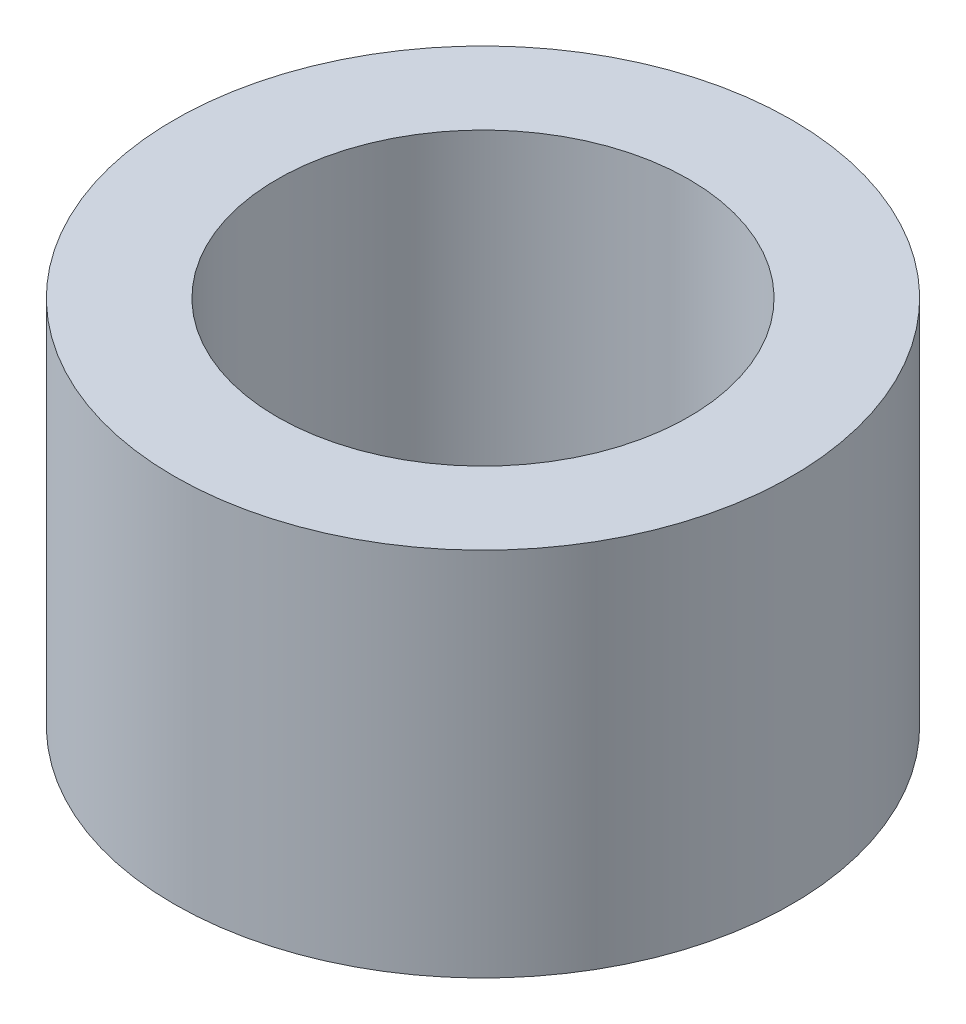
ISO-10303-21;
HEADER;
FILE_DESCRIPTION(('STEP AP214'),'2;1');
FILE_NAME('part.step','',(''),(''),'','','');
FILE_SCHEMA(('AUTOMOTIVE_DESIGN { 1 0 10303 214 1 1 1 1 }'));
ENDSEC;
DATA;
#1=APPLICATION_CONTEXT('core data for automotive mechanical design processes');
#2=APPLICATION_PROTOCOL_DEFINITION('international standard','automotive_design',2000,#1);
#3=PRODUCT_CONTEXT('',#1,'mechanical');
#4=PRODUCT('Part','Part','',(#3));
#5=PRODUCT_RELATED_PRODUCT_CATEGORY('part','',(#4));
#6=PRODUCT_DEFINITION_FORMATION('','',#4);
#7=PRODUCT_DEFINITION_CONTEXT('part definition',#1,'design');
#8=PRODUCT_DEFINITION('design','',#6,#7);
#9=PRODUCT_DEFINITION_SHAPE('','',#8);
#10=(LENGTH_UNIT() NAMED_UNIT(*) SI_UNIT(.MILLI.,.METRE.));
#11=(NAMED_UNIT(*) PLANE_ANGLE_UNIT() SI_UNIT($,.RADIAN.));
#12=(NAMED_UNIT(*) SI_UNIT($,.STERADIAN.) SOLID_ANGLE_UNIT());
#13=UNCERTAINTY_MEASURE_WITH_UNIT(LENGTH_MEASURE(1.E-05),#10,'distance_accuracy_value','');
#14=(GEOMETRIC_REPRESENTATION_CONTEXT(3) GLOBAL_UNCERTAINTY_ASSIGNED_CONTEXT((#13)) GLOBAL_UNIT_ASSIGNED_CONTEXT((#10,
#11,#12)) REPRESENTATION_CONTEXT('',''));
#15=CARTESIAN_POINT('',(0.,0.,0.));
#16=DIRECTION('',(0.,0.,1.));
#17=DIRECTION('',(1.,0.,0.));
#18=AXIS2_PLACEMENT_3D('',#15,#16,#17);
#19=CARTESIAN_POINT('',(0.,3.6,0.));
#20=DIRECTION('',(0.,1.,0.));
#21=DIRECTION('',(0.,0.,1.));
#22=AXIS2_PLACEMENT_3D('',#19,#20,#21);
#23=PLANE('',#22);
#24=CARTESIAN_POINT('',(0.,3.6,0.));
#25=DIRECTION('',(0.,1.,0.));
#26=DIRECTION('',(0.,0.,1.));
#27=AXIS2_PLACEMENT_3D('',#24,#25,#26);
#28=CIRCLE('',#27,3.);
#29=CARTESIAN_POINT('',(0.,3.6,3.));
#30=VERTEX_POINT('',#29);
#31=EDGE_CURVE('E10',#30,#30,#28,.T.);
#32=ORIENTED_EDGE('',*,*,#31,.T.);
#33=EDGE_LOOP('',(#32));
#34=FACE_BOUND('',#33,.T.);
#35=CARTESIAN_POINT('',(0.,3.6,0.));
#36=DIRECTION('',(0.,1.,0.));
#37=DIRECTION('',(0.,0.,1.));
#38=AXIS2_PLACEMENT_3D('',#35,#36,#37);
#39=CIRCLE('',#38,2.);
#40=CARTESIAN_POINT('',(0.,3.6,2.));
#41=VERTEX_POINT('',#40);
#42=EDGE_CURVE('E43',#41,#41,#39,.T.);
#43=ORIENTED_EDGE('',*,*,#42,.F.);
#44=EDGE_LOOP('',(#43));
#45=FACE_BOUND('',#44,.T.);
#46=ADVANCED_FACE('F32',(#34,#45),#23,.T.);
#47=CARTESIAN_POINT('',(0.,0.,0.));
#48=DIRECTION('',(0.,1.,0.));
#49=DIRECTION('',(0.,0.,1.));
#50=AXIS2_PLACEMENT_3D('',#47,#48,#49);
#51=PLANE('',#50);
#52=CARTESIAN_POINT('',(0.,0.,0.));
#53=DIRECTION('',(0.,1.,0.));
#54=DIRECTION('',(0.,0.,1.));
#55=AXIS2_PLACEMENT_3D('',#52,#53,#54);
#56=CIRCLE('',#55,3.);
#57=CARTESIAN_POINT('',(0.,0.,3.));
#58=VERTEX_POINT('',#57);
#59=EDGE_CURVE('E36',#58,#58,#56,.T.);
#60=ORIENTED_EDGE('',*,*,#59,.F.);
#61=EDGE_LOOP('',(#60));
#62=FACE_BOUND('',#61,.T.);
#63=CARTESIAN_POINT('',(0.,0.,0.));
#64=DIRECTION('',(0.,1.,0.));
#65=DIRECTION('',(0.,0.,1.));
#66=AXIS2_PLACEMENT_3D('',#63,#64,#65);
#67=CIRCLE('',#66,2.);
#68=CARTESIAN_POINT('',(0.,0.,2.));
#69=VERTEX_POINT('',#68);
#70=EDGE_CURVE('E45',#69,#69,#67,.T.);
#71=ORIENTED_EDGE('',*,*,#70,.T.);
#72=EDGE_LOOP('',(#71));
#73=FACE_BOUND('',#72,.T.);
#74=ADVANCED_FACE('F55',(#62,#73),#51,.F.);
#75=CARTESIAN_POINT('',(0.,3.6,0.));
#76=DIRECTION('',(0.,-1.,0.));
#77=DIRECTION('',(0.,0.,-1.));
#78=AXIS2_PLACEMENT_3D('',#75,#76,#77);
#79=CYLINDRICAL_SURFACE('',#78,3.);
#80=ORIENTED_EDGE('',*,*,#31,.F.);
#81=EDGE_LOOP('',(#80));
#82=FACE_BOUND('',#81,.T.);
#83=ORIENTED_EDGE('',*,*,#59,.T.);
#84=EDGE_LOOP('',(#83));
#85=FACE_BOUND('',#84,.T.);
#86=ADVANCED_FACE('F34',(#82,#85),#79,.T.);
#87=CARTESIAN_POINT('',(0.,3.6,0.));
#88=DIRECTION('',(0.,-1.,0.));
#89=DIRECTION('',(0.,0.,-1.));
#90=AXIS2_PLACEMENT_3D('',#87,#88,#89);
#91=CYLINDRICAL_SURFACE('',#90,2.);
#92=ORIENTED_EDGE('',*,*,#42,.T.);
#93=EDGE_LOOP('',(#92));
#94=FACE_BOUND('',#93,.T.);
#95=ORIENTED_EDGE('',*,*,#70,.F.);
#96=EDGE_LOOP('',(#95));
#97=FACE_BOUND('',#96,.T.);
#98=ADVANCED_FACE('F51',(#94,#97),#91,.F.);
#99=CLOSED_SHELL('',(#46,#74,#86,#98));
#100=MANIFOLD_SOLID_BREP('B2',#99);
#101=ADVANCED_BREP_SHAPE_REPRESENTATION('',(#18,#100),#14);
#102=SHAPE_DEFINITION_REPRESENTATION(#9,#101);
ENDSEC;
END-ISO-10303-21;
